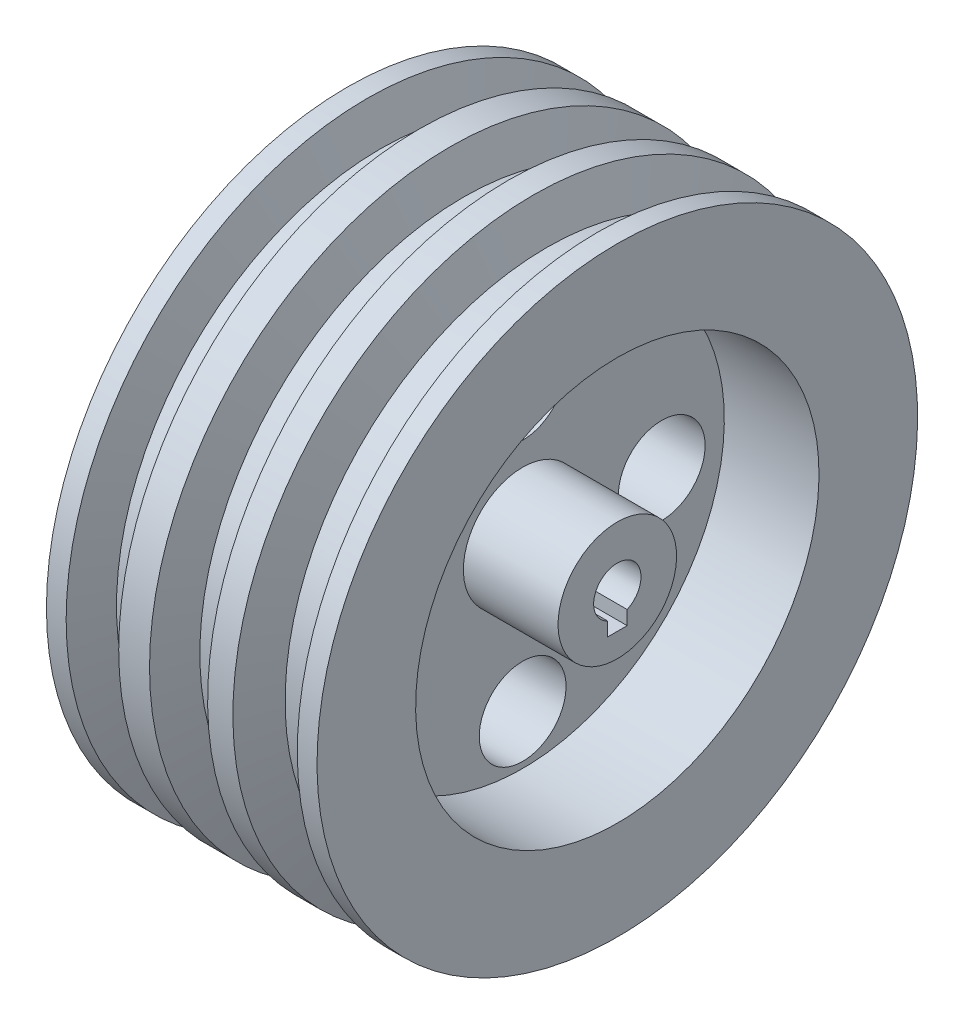
ISO-10303-21;
HEADER;
FILE_DESCRIPTION(('STEP AP214'),'2;1');
FILE_NAME('part.step','',(''),(''),'','','');
FILE_SCHEMA(('AUTOMOTIVE_DESIGN { 1 0 10303 214 1 1 1 1 }'));
ENDSEC;
DATA;
#1=APPLICATION_CONTEXT('core data for automotive mechanical design processes');
#2=APPLICATION_PROTOCOL_DEFINITION('international standard','automotive_design',2000,#1);
#3=PRODUCT_CONTEXT('',#1,'mechanical');
#4=PRODUCT('Part','Part','',(#3));
#5=PRODUCT_RELATED_PRODUCT_CATEGORY('part','',(#4));
#6=PRODUCT_DEFINITION_FORMATION('','',#4);
#7=PRODUCT_DEFINITION_CONTEXT('part definition',#1,'design');
#8=PRODUCT_DEFINITION('design','',#6,#7);
#9=PRODUCT_DEFINITION_SHAPE('','',#8);
#10=(LENGTH_UNIT() NAMED_UNIT(*) SI_UNIT(.MILLI.,.METRE.));
#11=(NAMED_UNIT(*) PLANE_ANGLE_UNIT() SI_UNIT($,.RADIAN.));
#12=(NAMED_UNIT(*) SI_UNIT($,.STERADIAN.) SOLID_ANGLE_UNIT());
#13=UNCERTAINTY_MEASURE_WITH_UNIT(LENGTH_MEASURE(1.E-05),#10,'distance_accuracy_value','');
#14=(GEOMETRIC_REPRESENTATION_CONTEXT(3) GLOBAL_UNCERTAINTY_ASSIGNED_CONTEXT((#13)) GLOBAL_UNIT_ASSIGNED_CONTEXT((#10,
#11,#12)) REPRESENTATION_CONTEXT('',''));
#15=CARTESIAN_POINT('',(0.,0.,0.));
#16=DIRECTION('',(0.,0.,1.));
#17=DIRECTION('',(1.,0.,0.));
#18=AXIS2_PLACEMENT_3D('',#15,#16,#17);
#19=CARTESIAN_POINT('',(35.,0.,0.));
#20=DIRECTION('',(-1.,0.,0.));
#21=DIRECTION('',(0.,-1.,0.));
#22=AXIS2_PLACEMENT_3D('',#19,#20,#21);
#23=PLANE('',#22);
#24=CARTESIAN_POINT('',(35.,3.3076923076923,0.));
#25=DIRECTION('',(1.,0.,0.));
#26=DIRECTION('',(0.,1.,0.));
#27=AXIS2_PLACEMENT_3D('',#24,#25,#26);
#28=CIRCLE('',#27,51.1282051282051);
#29=CARTESIAN_POINT('',(35.,54.4358974358974,0.));
#30=VERTEX_POINT('',#29);
#31=EDGE_CURVE('E125',#30,#30,#28,.T.);
#32=ORIENTED_EDGE('',*,*,#31,.F.);
#33=EDGE_LOOP('',(#32));
#34=FACE_BOUND('',#33,.T.);
#35=CARTESIAN_POINT('',(35.,3.3076923076923,0.));
#36=DIRECTION('',(1.,0.,0.));
#37=DIRECTION('',(0.,1.,0.));
#38=AXIS2_PLACEMENT_3D('',#35,#36,#37);
#39=CIRCLE('',#38,76.1282051282051);
#40=CARTESIAN_POINT('',(35.,79.4358974358974,0.));
#41=VERTEX_POINT('',#40);
#42=EDGE_CURVE('E42',#41,#41,#39,.T.);
#43=ORIENTED_EDGE('',*,*,#42,.T.);
#44=EDGE_LOOP('',(#43));
#45=FACE_BOUND('',#44,.T.);
#46=ADVANCED_FACE('F35',(#34,#45),#23,.F.);
#47=CARTESIAN_POINT('',(74.1794871794872,3.30769230769231,0.));
#48=DIRECTION('',(1.,0.,0.));
#49=DIRECTION('',(0.,1.,0.));
#50=AXIS2_PLACEMENT_3D('',#47,#48,#49);
#51=CYLINDRICAL_SURFACE('',#50,76.1282051282051);
#52=ORIENTED_EDGE('',*,*,#42,.F.);
#53=EDGE_LOOP('',(#52));
#54=FACE_BOUND('',#53,.T.);
#55=CARTESIAN_POINT('',(30.,3.3076923076923,0.));
#56=DIRECTION('',(1.,0.,0.));
#57=DIRECTION('',(0.,1.,0.));
#58=AXIS2_PLACEMENT_3D('',#55,#56,#57);
#59=CIRCLE('',#58,76.1282051282051);
#60=CARTESIAN_POINT('',(30.,79.4358974358974,0.));
#61=VERTEX_POINT('',#60);
#62=EDGE_CURVE('E190',#61,#61,#59,.T.);
#63=ORIENTED_EDGE('',*,*,#62,.T.);
#64=EDGE_LOOP('',(#63));
#65=FACE_BOUND('',#64,.T.);
#66=ADVANCED_FACE('F196',(#54,#65),#51,.T.);
#67=CARTESIAN_POINT('',(26.4750566288104,3.3076923076923,0.));
#68=DIRECTION('',(1.,0.,0.));
#69=DIRECTION('',(0.,1.,0.));
#70=AXIS2_PLACEMENT_3D('',#67,#68,#69);
#71=CONICAL_SURFACE('',#70,66.4435028110051,1.22173047639604);
#72=ORIENTED_EDGE('',*,*,#62,.F.);
#73=EDGE_LOOP('',(#72));
#74=FACE_BOUND('',#73,.T.);
#75=CARTESIAN_POINT('',(26.4750566288104,3.3076923076923,0.));
#76=DIRECTION('',(1.,0.,0.));
#77=DIRECTION('',(0.,1.,0.));
#78=AXIS2_PLACEMENT_3D('',#75,#76,#77);
#79=CIRCLE('',#78,66.4435028110051);
#80=CARTESIAN_POINT('',(26.4750566288103,69.7511951186974,0.));
#81=VERTEX_POINT('',#80);
#82=EDGE_CURVE('E187',#81,#81,#79,.T.);
#83=ORIENTED_EDGE('',*,*,#82,.T.);
#84=EDGE_LOOP('',(#83));
#85=FACE_BOUND('',#84,.T.);
#86=ADVANCED_FACE('F199',(#74,#85),#71,.T.);
#87=CARTESIAN_POINT('',(74.1794871794872,3.30769230769231,0.));
#88=DIRECTION('',(1.,0.,0.));
#89=DIRECTION('',(0.,1.,0.));
#90=AXIS2_PLACEMENT_3D('',#87,#88,#89);
#91=CYLINDRICAL_SURFACE('',#90,66.4435028110051);
#92=ORIENTED_EDGE('',*,*,#82,.F.);
#93=EDGE_LOOP('',(#92));
#94=FACE_BOUND('',#93,.T.);
#95=CARTESIAN_POINT('',(17.2265865441587,3.3076923076923,0.));
#96=DIRECTION('',(1.,0.,0.));
#97=DIRECTION('',(0.,1.,0.));
#98=AXIS2_PLACEMENT_3D('',#95,#96,#97);
#99=CIRCLE('',#98,66.4435028110051);
#100=CARTESIAN_POINT('',(17.2265865441587,69.7511951186974,0.));
#101=VERTEX_POINT('',#100);
#102=EDGE_CURVE('E184',#101,#101,#99,.T.);
#103=ORIENTED_EDGE('',*,*,#102,.T.);
#104=EDGE_LOOP('',(#103));
#105=FACE_BOUND('',#104,.T.);
#106=ADVANCED_FACE('F204',(#94,#105),#91,.T.);
#107=CARTESIAN_POINT('',(13.6942255874524,3.3076923076923,0.));
#108=DIRECTION('',(-1.,0.,0.));
#109=DIRECTION('',(0.,-1.,0.));
#110=AXIS2_PLACEMENT_3D('',#107,#108,#109);
#111=CONICAL_SURFACE('',#110,76.1485847769188,1.22173047639604);
#112=ORIENTED_EDGE('',*,*,#102,.F.);
#113=EDGE_LOOP('',(#112));
#114=FACE_BOUND('',#113,.T.);
#115=CARTESIAN_POINT('',(13.6942255874524,3.3076923076923,0.));
#116=DIRECTION('',(1.,0.,0.));
#117=DIRECTION('',(0.,1.,0.));
#118=AXIS2_PLACEMENT_3D('',#115,#116,#117);
#119=CIRCLE('',#118,76.1485847769189);
#120=CARTESIAN_POINT('',(13.6942255874524,79.4562770846112,0.));
#121=VERTEX_POINT('',#120);
#122=EDGE_CURVE('E181',#121,#121,#119,.T.);
#123=ORIENTED_EDGE('',*,*,#122,.T.);
#124=EDGE_LOOP('',(#123));
#125=FACE_BOUND('',#124,.T.);
#126=ADVANCED_FACE('F210',(#114,#125),#111,.T.);
#127=CARTESIAN_POINT('',(74.1794871794872,3.30769230769231,0.));
#128=DIRECTION('',(1.,0.,0.));
#129=DIRECTION('',(0.,1.,0.));
#130=AXIS2_PLACEMENT_3D('',#127,#128,#129);
#131=CYLINDRICAL_SURFACE('',#130,76.1485847769189);
#132=ORIENTED_EDGE('',*,*,#122,.F.);
#133=EDGE_LOOP('',(#132));
#134=FACE_BOUND('',#133,.T.);
#135=CARTESIAN_POINT('',(7.28740547758823,3.3076923076923,0.));
#136=DIRECTION('',(1.,0.,0.));
#137=DIRECTION('',(0.,1.,0.));
#138=AXIS2_PLACEMENT_3D('',#135,#136,#137);
#139=CIRCLE('',#138,76.1485847769189);
#140=CARTESIAN_POINT('',(7.28740547758822,79.4562770846112,0.));
#141=VERTEX_POINT('',#140);
#142=EDGE_CURVE('E178',#141,#141,#139,.T.);
#143=ORIENTED_EDGE('',*,*,#142,.T.);
#144=EDGE_LOOP('',(#143));
#145=FACE_BOUND('',#144,.T.);
#146=ADVANCED_FACE('F216',(#134,#145),#131,.T.);
#147=CARTESIAN_POINT('',(3.91051685733067,3.3076923076923,0.));
#148=DIRECTION('',(1.,0.,0.));
#149=DIRECTION('',(0.,1.,0.));
#150=AXIS2_PLACEMENT_3D('',#147,#148,#149);
#151=CONICAL_SURFACE('',#150,66.8706595447477,1.22173047639604);
#152=ORIENTED_EDGE('',*,*,#142,.F.);
#153=EDGE_LOOP('',(#152));
#154=FACE_BOUND('',#153,.T.);
#155=CARTESIAN_POINT('',(3.91051685733067,3.3076923076923,0.));
#156=DIRECTION('',(1.,0.,0.));
#157=DIRECTION('',(0.,1.,0.));
#158=AXIS2_PLACEMENT_3D('',#155,#156,#157);
#159=CIRCLE('',#158,66.8706595447478);
#160=CARTESIAN_POINT('',(3.91051685733066,70.17835185244,0.));
#161=VERTEX_POINT('',#160);
#162=EDGE_CURVE('E175',#161,#161,#159,.T.);
#163=ORIENTED_EDGE('',*,*,#162,.T.);
#164=EDGE_LOOP('',(#163));
#165=FACE_BOUND('',#164,.T.);
#166=ADVANCED_FACE('F222',(#154,#165),#151,.T.);
#167=CARTESIAN_POINT('',(74.1794871794872,3.30769230769231,0.));
#168=DIRECTION('',(1.,0.,0.));
#169=DIRECTION('',(0.,1.,0.));
#170=AXIS2_PLACEMENT_3D('',#167,#168,#169);
#171=CYLINDRICAL_SURFACE('',#170,66.8706595447477);
#172=ORIENTED_EDGE('',*,*,#162,.F.);
#173=EDGE_LOOP('',(#172));
#174=FACE_BOUND('',#173,.T.);
#175=CARTESIAN_POINT('',(-3.9608304898895,3.3076923076923,0.));
#176=DIRECTION('',(1.,0.,0.));
#177=DIRECTION('',(0.,1.,0.));
#178=AXIS2_PLACEMENT_3D('',#175,#176,#177);
#179=CIRCLE('',#178,66.8706595447478);
#180=CARTESIAN_POINT('',(-3.96083048988951,70.17835185244,0.));
#181=VERTEX_POINT('',#180);
#182=EDGE_CURVE('E172',#181,#181,#179,.T.);
#183=ORIENTED_EDGE('',*,*,#182,.T.);
#184=EDGE_LOOP('',(#183));
#185=FACE_BOUND('',#184,.T.);
#186=ADVANCED_FACE('F228',(#174,#185),#171,.T.);
#187=CARTESIAN_POINT('',(-7.36488321578584,3.3076923076923,0.));
#188=DIRECTION('',(-1.,0.,0.));
#189=DIRECTION('',(0.,-1.,0.));
#190=AXIS2_PLACEMENT_3D('',#187,#188,#189);
#191=CONICAL_SURFACE('',#190,76.223217543781,1.22173047639604);
#192=ORIENTED_EDGE('',*,*,#182,.F.);
#193=EDGE_LOOP('',(#192));
#194=FACE_BOUND('',#193,.T.);
#195=CARTESIAN_POINT('',(-7.36488321578584,3.3076923076923,0.));
#196=DIRECTION('',(1.,0.,0.));
#197=DIRECTION('',(0.,1.,0.));
#198=AXIS2_PLACEMENT_3D('',#195,#196,#197);
#199=CIRCLE('',#198,76.2232175437811);
#200=CARTESIAN_POINT('',(-7.36488321578585,79.5309098514734,0.));
#201=VERTEX_POINT('',#200);
#202=EDGE_CURVE('E169',#201,#201,#199,.T.);
#203=ORIENTED_EDGE('',*,*,#202,.T.);
#204=EDGE_LOOP('',(#203));
#205=FACE_BOUND('',#204,.T.);
#206=ADVANCED_FACE('F234',(#194,#205),#191,.T.);
#207=CARTESIAN_POINT('',(74.1794871794872,3.30769230769231,0.));
#208=DIRECTION('',(1.,0.,0.));
#209=DIRECTION('',(0.,1.,0.));
#210=AXIS2_PLACEMENT_3D('',#207,#208,#209);
#211=CYLINDRICAL_SURFACE('',#210,76.223217543781);
#212=ORIENTED_EDGE('',*,*,#202,.F.);
#213=EDGE_LOOP('',(#212));
#214=FACE_BOUND('',#213,.T.);
#215=CARTESIAN_POINT('',(-15.1773010662251,3.3076923076923,0.));
#216=DIRECTION('',(1.,0.,0.));
#217=DIRECTION('',(0.,1.,0.));
#218=AXIS2_PLACEMENT_3D('',#215,#216,#217);
#219=CIRCLE('',#218,76.223217543781);
#220=CARTESIAN_POINT('',(-15.1773010662251,79.5309098514734,0.));
#221=VERTEX_POINT('',#220);
#222=EDGE_CURVE('E166',#221,#221,#219,.T.);
#223=ORIENTED_EDGE('',*,*,#222,.T.);
#224=EDGE_LOOP('',(#223));
#225=FACE_BOUND('',#224,.T.);
#226=ADVANCED_FACE('F240',(#214,#225),#211,.T.);
#227=CARTESIAN_POINT('',(-18.5541896864826,3.3076923076923,0.));
#228=DIRECTION('',(1.,0.,0.));
#229=DIRECTION('',(0.,1.,0.));
#230=AXIS2_PLACEMENT_3D('',#227,#228,#229);
#231=CONICAL_SURFACE('',#230,66.9452923116099,1.22173047639604);
#232=ORIENTED_EDGE('',*,*,#222,.F.);
#233=EDGE_LOOP('',(#232));
#234=FACE_BOUND('',#233,.T.);
#235=CARTESIAN_POINT('',(-18.5541896864826,3.3076923076923,0.));
#236=DIRECTION('',(1.,0.,0.));
#237=DIRECTION('',(0.,1.,0.));
#238=AXIS2_PLACEMENT_3D('',#235,#236,#237);
#239=CIRCLE('',#238,66.9452923116099);
#240=CARTESIAN_POINT('',(-18.5541896864826,70.2529846193023,0.));
#241=VERTEX_POINT('',#240);
#242=EDGE_CURVE('E163',#241,#241,#239,.T.);
#243=ORIENTED_EDGE('',*,*,#242,.T.);
#244=EDGE_LOOP('',(#243));
#245=FACE_BOUND('',#244,.T.);
#246=ADVANCED_FACE('F246',(#234,#245),#231,.T.);
#247=CARTESIAN_POINT('',(74.1794871794872,3.30769230769231,0.));
#248=DIRECTION('',(1.,0.,0.));
#249=DIRECTION('',(0.,1.,0.));
#250=AXIS2_PLACEMENT_3D('',#247,#248,#249);
#251=CYLINDRICAL_SURFACE('',#250,66.9452923116099);
#252=ORIENTED_EDGE('',*,*,#242,.F.);
#253=EDGE_LOOP('',(#252));
#254=FACE_BOUND('',#253,.T.);
#255=CARTESIAN_POINT('',(-25.0199392931278,3.3076923076923,0.));
#256=DIRECTION('',(1.,0.,0.));
#257=DIRECTION('',(0.,1.,0.));
#258=AXIS2_PLACEMENT_3D('',#255,#256,#257);
#259=CIRCLE('',#258,66.9452923116099);
#260=CARTESIAN_POINT('',(-25.0199392931278,70.2529846193022,0.));
#261=VERTEX_POINT('',#260);
#262=EDGE_CURVE('E160',#261,#261,#259,.T.);
#263=ORIENTED_EDGE('',*,*,#262,.T.);
#264=EDGE_LOOP('',(#263));
#265=FACE_BOUND('',#264,.T.);
#266=ADVANCED_FACE('F252',(#254,#265),#251,.T.);
#267=CARTESIAN_POINT('',(-28.4239920190241,3.3076923076923,0.));
#268=DIRECTION('',(-1.,0.,0.));
#269=DIRECTION('',(0.,-1.,0.));
#270=AXIS2_PLACEMENT_3D('',#267,#268,#269);
#271=CONICAL_SURFACE('',#270,76.2978503106433,1.22173047639604);
#272=ORIENTED_EDGE('',*,*,#262,.F.);
#273=EDGE_LOOP('',(#272));
#274=FACE_BOUND('',#273,.T.);
#275=CARTESIAN_POINT('',(-28.4239920190241,3.3076923076923,0.));
#276=DIRECTION('',(1.,0.,0.));
#277=DIRECTION('',(0.,1.,0.));
#278=AXIS2_PLACEMENT_3D('',#275,#276,#277);
#279=CIRCLE('',#278,76.2978503106433);
#280=CARTESIAN_POINT('',(-28.4239920190241,79.6055426183356,0.));
#281=VERTEX_POINT('',#280);
#282=EDGE_CURVE('E157',#281,#281,#279,.T.);
#283=ORIENTED_EDGE('',*,*,#282,.T.);
#284=EDGE_LOOP('',(#283));
#285=FACE_BOUND('',#284,.T.);
#286=ADVANCED_FACE('F258',(#274,#285),#271,.T.);
#287=CARTESIAN_POINT('',(74.1794871794872,3.30769230769231,0.));
#288=DIRECTION('',(1.,0.,0.));
#289=DIRECTION('',(0.,1.,0.));
#290=AXIS2_PLACEMENT_3D('',#287,#288,#289);
#291=CYLINDRICAL_SURFACE('',#290,76.2978503106433);
#292=ORIENTED_EDGE('',*,*,#282,.F.);
#293=EDGE_LOOP('',(#292));
#294=FACE_BOUND('',#293,.T.);
#295=CARTESIAN_POINT('',(-33.4239920190241,3.3076923076923,0.));
#296=DIRECTION('',(1.,0.,0.));
#297=DIRECTION('',(0.,1.,0.));
#298=AXIS2_PLACEMENT_3D('',#295,#296,#297);
#299=CIRCLE('',#298,76.2978503106433);
#300=CARTESIAN_POINT('',(-33.4239920190241,79.6055426183355,0.));
#301=VERTEX_POINT('',#300);
#302=EDGE_CURVE('E154',#301,#301,#299,.T.);
#303=ORIENTED_EDGE('',*,*,#302,.T.);
#304=EDGE_LOOP('',(#303));
#305=FACE_BOUND('',#304,.T.);
#306=ADVANCED_FACE('F264',(#294,#305),#291,.T.);
#307=CARTESIAN_POINT('',(-33.4239920190241,0.,0.));
#308=DIRECTION('',(1.,0.,0.));
#309=DIRECTION('',(0.,1.,0.));
#310=AXIS2_PLACEMENT_3D('',#307,#308,#309);
#311=PLANE('',#310);
#312=ORIENTED_EDGE('',*,*,#302,.F.);
#313=EDGE_LOOP('',(#312));
#314=FACE_BOUND('',#313,.T.);
#315=CARTESIAN_POINT('',(-33.4239920190241,3.3076923076923,0.));
#316=DIRECTION('',(1.,0.,0.));
#317=DIRECTION('',(0.,1.,0.));
#318=AXIS2_PLACEMENT_3D('',#315,#316,#317);
#319=CIRCLE('',#318,51.2978503106433);
#320=CARTESIAN_POINT('',(-33.4239920190241,54.6055426183355,0.));
#321=VERTEX_POINT('',#320);
#322=EDGE_CURVE('E151',#321,#321,#319,.T.);
#323=ORIENTED_EDGE('',*,*,#322,.T.);
#324=EDGE_LOOP('',(#323));
#325=FACE_BOUND('',#324,.T.);
#326=ADVANCED_FACE('F270',(#314,#325),#311,.F.);
#327=CARTESIAN_POINT('',(74.1794871794872,3.30769230769231,0.));
#328=DIRECTION('',(1.,0.,0.));
#329=DIRECTION('',(0.,1.,0.));
#330=AXIS2_PLACEMENT_3D('',#327,#328,#329);
#331=CYLINDRICAL_SURFACE('',#330,51.2978503106433);
#332=ORIENTED_EDGE('',*,*,#322,.F.);
#333=EDGE_LOOP('',(#332));
#334=FACE_BOUND('',#333,.T.);
#335=CARTESIAN_POINT('',(-11.,3.3076923076923,0.));
#336=DIRECTION('',(1.,0.,0.));
#337=DIRECTION('',(0.,1.,0.));
#338=AXIS2_PLACEMENT_3D('',#335,#336,#337);
#339=CIRCLE('',#338,51.2978503106432);
#340=CARTESIAN_POINT('',(-11.,54.6055426183355,0.));
#341=VERTEX_POINT('',#340);
#342=EDGE_CURVE('E148',#341,#341,#339,.T.);
#343=ORIENTED_EDGE('',*,*,#342,.T.);
#344=EDGE_LOOP('',(#343));
#345=FACE_BOUND('',#344,.T.);
#346=ADVANCED_FACE('F276',(#334,#345),#331,.F.);
#347=CARTESIAN_POINT('',(-11.,0.,0.));
#348=DIRECTION('',(1.,0.,0.));
#349=DIRECTION('',(0.,1.,0.));
#350=AXIS2_PLACEMENT_3D('',#347,#348,#349);
#351=PLANE('',#350);
#352=CARTESIAN_POINT('',(-11.,-1.00124435404936E-12,35.2569151452964));
#353=DIRECTION('',(1.,0.,0.));
#354=DIRECTION('',(0.,1.,0.));
#355=AXIS2_PLACEMENT_3D('',#352,#353,#354);
#356=CIRCLE('',#355,11.0000000000016);
#357=CARTESIAN_POINT('',(-11.,11.0000000000006,35.2569151452964));
#358=VERTEX_POINT('',#357);
#359=EDGE_CURVE('E122',#358,#358,#356,.T.);
#360=ORIENTED_EDGE('',*,*,#359,.T.);
#361=EDGE_LOOP('',(#360));
#362=FACE_BOUND('',#361,.T.);
#363=CARTESIAN_POINT('',(-11.,9.9424378763864E-13,-35.2569151452984));
#364=DIRECTION('',(1.,0.,0.));
#365=DIRECTION('',(0.,1.,0.));
#366=AXIS2_PLACEMENT_3D('',#363,#364,#365);
#367=CIRCLE('',#366,11.0000000000008);
#368=CARTESIAN_POINT('',(-11.,11.0000000000018,-35.2569151452984));
#369=VERTEX_POINT('',#368);
#370=EDGE_CURVE('E119',#369,#369,#367,.T.);
#371=ORIENTED_EDGE('',*,*,#370,.T.);
#372=EDGE_LOOP('',(#371));
#373=FACE_BOUND('',#372,.T.);
#374=CARTESIAN_POINT('',(-11.,-35.2569151452974,-1.99117041485995E-12));
#375=DIRECTION('',(1.,0.,0.));
#376=DIRECTION('',(0.,1.,0.));
#377=AXIS2_PLACEMENT_3D('',#374,#375,#376);
#378=CIRCLE('',#377,11.0000000000021);
#379=CARTESIAN_POINT('',(-11.,-24.2569151452952,-1.99117041485995E-12));
#380=VERTEX_POINT('',#379);
#381=EDGE_CURVE('E116',#380,#380,#378,.T.);
#382=ORIENTED_EDGE('',*,*,#381,.T.);
#383=EDGE_LOOP('',(#382));
#384=FACE_BOUND('',#383,.T.);
#385=CARTESIAN_POINT('',(-11.,35.2569151452974,0.));
#386=DIRECTION('',(1.,0.,0.));
#387=DIRECTION('',(0.,1.,0.));
#388=AXIS2_PLACEMENT_3D('',#385,#386,#387);
#389=CIRCLE('',#388,11.);
#390=CARTESIAN_POINT('',(-11.,46.2569151452974,0.));
#391=VERTEX_POINT('',#390);
#392=EDGE_CURVE('E105',#391,#391,#389,.T.);
#393=ORIENTED_EDGE('',*,*,#392,.T.);
#394=EDGE_LOOP('',(#393));
#395=FACE_BOUND('',#394,.T.);
#396=ORIENTED_EDGE('',*,*,#342,.F.);
#397=EDGE_LOOP('',(#396));
#398=FACE_BOUND('',#397,.T.);
#399=CARTESIAN_POINT('',(-11.,3.3076923076923,0.));
#400=DIRECTION('',(1.,0.,0.));
#401=DIRECTION('',(0.,1.,0.));
#402=AXIS2_PLACEMENT_3D('',#399,#400,#401);
#403=CIRCLE('',#402,15.025641025641);
#404=CARTESIAN_POINT('',(-11.,18.3333333333333,0.));
#405=VERTEX_POINT('',#404);
#406=EDGE_CURVE('E145',#405,#405,#403,.T.);
#407=ORIENTED_EDGE('',*,*,#406,.T.);
#408=EDGE_LOOP('',(#407));
#409=FACE_BOUND('',#408,.T.);
#410=ADVANCED_FACE('F282',(#362,#373,#384,#395,#398,#409),#351,.F.);
#411=CARTESIAN_POINT('',(74.1794871794872,3.30769230769231,0.));
#412=DIRECTION('',(1.,0.,0.));
#413=DIRECTION('',(0.,1.,0.));
#414=AXIS2_PLACEMENT_3D('',#411,#412,#413);
#415=CYLINDRICAL_SURFACE('',#414,15.025641025641);
#416=CARTESIAN_POINT('',(-35.,3.3076923076923,0.));
#417=DIRECTION('',(1.,0.,0.));
#418=DIRECTION('',(0.,1.,0.));
#419=AXIS2_PLACEMENT_3D('',#416,#417,#418);
#420=CIRCLE('',#419,15.025641025641);
#421=CARTESIAN_POINT('',(-35.,18.3333333333333,0.));
#422=VERTEX_POINT('',#421);
#423=EDGE_CURVE('E142',#422,#422,#420,.T.);
#424=ORIENTED_EDGE('',*,*,#423,.T.);
#425=EDGE_LOOP('',(#424));
#426=FACE_BOUND('',#425,.T.);
#427=ORIENTED_EDGE('',*,*,#406,.F.);
#428=EDGE_LOOP('',(#427));
#429=FACE_BOUND('',#428,.T.);
#430=ADVANCED_FACE('F288',(#426,#429),#415,.T.);
#431=CARTESIAN_POINT('',(-35.,0.,0.));
#432=DIRECTION('',(1.,0.,0.));
#433=DIRECTION('',(0.,1.,0.));
#434=AXIS2_PLACEMENT_3D('',#431,#432,#433);
#435=PLANE('',#434);
#436=ORIENTED_EDGE('',*,*,#423,.F.);
#437=EDGE_LOOP('',(#436));
#438=FACE_BOUND('',#437,.T.);
#439=CARTESIAN_POINT('',(-35.,3.3076923076923,0.));
#440=DIRECTION('',(1.,0.,0.));
#441=DIRECTION('',(0.,1.,0.));
#442=AXIS2_PLACEMENT_3D('',#439,#440,#441);
#443=CIRCLE('',#442,6.00000000000001);
#444=CARTESIAN_POINT('',(-35.,-2.14666374962557,-2.5));
#445=VERTEX_POINT('',#444);
#446=CARTESIAN_POINT('',(-35.,-2.14666374962557,2.5));
#447=VERTEX_POINT('',#446);
#448=EDGE_CURVE('E139',#445,#447,#443,.T.);
#449=ORIENTED_EDGE('',*,*,#448,.T.);
#450=DIRECTION('',(0.,1.,0.));
#451=VECTOR('',#450,1.);
#452=CARTESIAN_POINT('',(-35.,0.307692307692287,2.5));
#453=LINE('',#452,#451);
#454=CARTESIAN_POINT('',(-35.,-5.69230769230771,2.5));
#455=VERTEX_POINT('',#454);
#456=EDGE_CURVE('E94',#455,#447,#453,.T.);
#457=ORIENTED_EDGE('',*,*,#456,.F.);
#458=DIRECTION('',(0.,0.,1.));
#459=VECTOR('',#458,1.);
#460=CARTESIAN_POINT('',(-35.,-5.69230769230771,-2.5));
#461=LINE('',#460,#459);
#462=CARTESIAN_POINT('',(-35.,-5.69230769230771,-2.5));
#463=VERTEX_POINT('',#462);
#464=EDGE_CURVE('E77',#463,#455,#461,.T.);
#465=ORIENTED_EDGE('',*,*,#464,.F.);
#466=DIRECTION('',(0.,-1.,0.));
#467=VECTOR('',#466,1.);
#468=CARTESIAN_POINT('',(-35.,0.307692307692287,-2.5));
#469=LINE('',#468,#467);
#470=EDGE_CURVE('E96',#445,#463,#469,.T.);
#471=ORIENTED_EDGE('',*,*,#470,.F.);
#472=EDGE_LOOP('',(#449,#457,#465,#471));
#473=FACE_BOUND('',#472,.T.);
#474=ADVANCED_FACE('F294',(#438,#473),#435,.F.);
#475=CARTESIAN_POINT('',(74.1794871794872,3.30769230769231,0.));
#476=DIRECTION('',(1.,0.,0.));
#477=DIRECTION('',(0.,1.,0.));
#478=AXIS2_PLACEMENT_3D('',#475,#476,#477);
#479=CYLINDRICAL_SURFACE('',#478,6.00000000000001);
#480=DIRECTION('',(1.,0.,0.));
#481=VECTOR('',#480,1.);
#482=CARTESIAN_POINT('',(74.1794871794872,-2.14666374962556,2.5));
#483=LINE('',#482,#481);
#484=CARTESIAN_POINT('',(35.,-2.14666374962556,2.5));
#485=VERTEX_POINT('',#484);
#486=EDGE_CURVE('E57',#447,#485,#483,.T.);
#487=ORIENTED_EDGE('',*,*,#486,.F.);
#488=ORIENTED_EDGE('',*,*,#448,.F.);
#489=DIRECTION('',(1.,0.,0.));
#490=VECTOR('',#489,1.);
#491=CARTESIAN_POINT('',(74.1794871794872,-2.14666374962556,-2.5));
#492=LINE('',#491,#490);
#493=CARTESIAN_POINT('',(35.,-2.14666374962556,-2.5));
#494=VERTEX_POINT('',#493);
#495=EDGE_CURVE('E79',#494,#445,#492,.F.);
#496=ORIENTED_EDGE('',*,*,#495,.F.);
#497=CARTESIAN_POINT('',(35.,3.3076923076923,0.));
#498=DIRECTION('',(1.,0.,0.));
#499=DIRECTION('',(0.,1.,0.));
#500=AXIS2_PLACEMENT_3D('',#497,#498,#499);
#501=CIRCLE('',#500,6.00000000000001);
#502=EDGE_CURVE('E137',#494,#485,#501,.T.);
#503=ORIENTED_EDGE('',*,*,#502,.T.);
#504=EDGE_LOOP('',(#487,#488,#496,#503));
#505=FACE_BOUND('',#504,.T.);
#506=ADVANCED_FACE('F300',(#505),#479,.F.);
#507=CARTESIAN_POINT('',(35.,0.,0.));
#508=DIRECTION('',(1.,0.,0.));
#509=DIRECTION('',(0.,1.,0.));
#510=AXIS2_PLACEMENT_3D('',#507,#508,#509);
#511=PLANE('',#510);
#512=DIRECTION('',(0.,1.,0.));
#513=VECTOR('',#512,1.);
#514=CARTESIAN_POINT('',(35.,0.307692307692296,2.5));
#515=LINE('',#514,#513);
#516=CARTESIAN_POINT('',(35.,-5.6923076923077,2.5));
#517=VERTEX_POINT('',#516);
#518=EDGE_CURVE('E82',#517,#485,#515,.T.);
#519=ORIENTED_EDGE('',*,*,#518,.T.);
#520=ORIENTED_EDGE('',*,*,#502,.F.);
#521=DIRECTION('',(0.,1.,0.));
#522=VECTOR('',#521,1.);
#523=CARTESIAN_POINT('',(35.,0.,-2.5));
#524=LINE('',#523,#522);
#525=CARTESIAN_POINT('',(35.,-5.69230769230771,-2.5));
#526=VERTEX_POINT('',#525);
#527=EDGE_CURVE('E11',#526,#494,#524,.T.);
#528=ORIENTED_EDGE('',*,*,#527,.F.);
#529=DIRECTION('',(0.,0.,1.));
#530=VECTOR('',#529,1.);
#531=CARTESIAN_POINT('',(35.,-5.6923076923077,-2.5));
#532=LINE('',#531,#530);
#533=EDGE_CURVE('E49',#526,#517,#532,.T.);
#534=ORIENTED_EDGE('',*,*,#533,.T.);
#535=EDGE_LOOP('',(#519,#520,#528,#534));
#536=FACE_BOUND('',#535,.T.);
#537=CARTESIAN_POINT('',(35.,3.3076923076923,0.));
#538=DIRECTION('',(1.,0.,0.));
#539=DIRECTION('',(0.,1.,0.));
#540=AXIS2_PLACEMENT_3D('',#537,#538,#539);
#541=CIRCLE('',#540,15.025641025641);
#542=CARTESIAN_POINT('',(35.,18.3333333333333,0.));
#543=VERTEX_POINT('',#542);
#544=EDGE_CURVE('E134',#543,#543,#541,.T.);
#545=ORIENTED_EDGE('',*,*,#544,.T.);
#546=EDGE_LOOP('',(#545));
#547=FACE_BOUND('',#546,.T.);
#548=ADVANCED_FACE('F89',(#536,#547),#511,.T.);
#549=CARTESIAN_POINT('',(74.1794871794872,3.30769230769231,0.));
#550=DIRECTION('',(1.,0.,0.));
#551=DIRECTION('',(0.,1.,0.));
#552=AXIS2_PLACEMENT_3D('',#549,#550,#551);
#553=CYLINDRICAL_SURFACE('',#552,15.025641025641);
#554=CARTESIAN_POINT('',(11.,3.3076923076923,0.));
#555=DIRECTION('',(1.,0.,0.));
#556=DIRECTION('',(0.,1.,0.));
#557=AXIS2_PLACEMENT_3D('',#554,#555,#556);
#558=CIRCLE('',#557,15.025641025641);
#559=CARTESIAN_POINT('',(11.,18.3333333333333,0.));
#560=VERTEX_POINT('',#559);
#561=EDGE_CURVE('E131',#560,#560,#558,.T.);
#562=ORIENTED_EDGE('',*,*,#561,.T.);
#563=EDGE_LOOP('',(#562));
#564=FACE_BOUND('',#563,.T.);
#565=ORIENTED_EDGE('',*,*,#544,.F.);
#566=EDGE_LOOP('',(#565));
#567=FACE_BOUND('',#566,.T.);
#568=ADVANCED_FACE('F319',(#564,#567),#553,.T.);
#569=CARTESIAN_POINT('',(11.,0.,0.));
#570=DIRECTION('',(1.,0.,0.));
#571=DIRECTION('',(0.,1.,0.));
#572=AXIS2_PLACEMENT_3D('',#569,#570,#571);
#573=PLANE('',#572);
#574=CARTESIAN_POINT('',(11.,-9.9856151446669E-13,35.2569151452964));
#575=DIRECTION('',(1.,0.,0.));
#576=DIRECTION('',(0.,1.,0.));
#577=AXIS2_PLACEMENT_3D('',#574,#575,#576);
#578=CIRCLE('',#577,11.0000000000016);
#579=CARTESIAN_POINT('',(11.,11.0000000000006,35.2569151452964));
#580=VERTEX_POINT('',#579);
#581=EDGE_CURVE('E102',#580,#580,#578,.T.);
#582=ORIENTED_EDGE('',*,*,#581,.F.);
#583=EDGE_LOOP('',(#582));
#584=FACE_BOUND('',#583,.T.);
#585=CARTESIAN_POINT('',(11.,9.96926627221314E-13,-35.2569151452984));
#586=DIRECTION('',(1.,0.,0.));
#587=DIRECTION('',(0.,1.,0.));
#588=AXIS2_PLACEMENT_3D('',#585,#586,#587);
#589=CIRCLE('',#588,11.0000000000008);
#590=CARTESIAN_POINT('',(11.,11.0000000000018,-35.2569151452984));
#591=VERTEX_POINT('',#590);
#592=EDGE_CURVE('E106',#591,#591,#589,.T.);
#593=ORIENTED_EDGE('',*,*,#592,.F.);
#594=EDGE_LOOP('',(#593));
#595=FACE_BOUND('',#594,.T.);
#596=CARTESIAN_POINT('',(11.,-35.2569151452974,-1.99117041485995E-12));
#597=DIRECTION('',(1.,0.,0.));
#598=DIRECTION('',(0.,1.,0.));
#599=AXIS2_PLACEMENT_3D('',#596,#597,#598);
#600=CIRCLE('',#599,11.0000000000021);
#601=CARTESIAN_POINT('',(11.,-24.2569151452952,-1.99117041485995E-12));
#602=VERTEX_POINT('',#601);
#603=EDGE_CURVE('E109',#602,#602,#600,.T.);
#604=ORIENTED_EDGE('',*,*,#603,.F.);
#605=EDGE_LOOP('',(#604));
#606=FACE_BOUND('',#605,.T.);
#607=CARTESIAN_POINT('',(11.,35.2569151452974,0.));
#608=DIRECTION('',(1.,0.,0.));
#609=DIRECTION('',(0.,1.,0.));
#610=AXIS2_PLACEMENT_3D('',#607,#608,#609);
#611=CIRCLE('',#610,11.);
#612=CARTESIAN_POINT('',(11.,46.2569151452974,0.));
#613=VERTEX_POINT('',#612);
#614=EDGE_CURVE('E101',#613,#613,#611,.T.);
#615=ORIENTED_EDGE('',*,*,#614,.F.);
#616=EDGE_LOOP('',(#615));
#617=FACE_BOUND('',#616,.T.);
#618=CARTESIAN_POINT('',(11.,3.3076923076923,0.));
#619=DIRECTION('',(1.,0.,0.));
#620=DIRECTION('',(0.,1.,0.));
#621=AXIS2_PLACEMENT_3D('',#618,#619,#620);
#622=CIRCLE('',#621,51.1282051282051);
#623=CARTESIAN_POINT('',(11.,54.4358974358974,0.));
#624=VERTEX_POINT('',#623);
#625=EDGE_CURVE('E128',#624,#624,#622,.T.);
#626=ORIENTED_EDGE('',*,*,#625,.T.);
#627=EDGE_LOOP('',(#626));
#628=FACE_BOUND('',#627,.T.);
#629=ORIENTED_EDGE('',*,*,#561,.F.);
#630=EDGE_LOOP('',(#629));
#631=FACE_BOUND('',#630,.T.);
#632=ADVANCED_FACE('F313',(#584,#595,#606,#617,#628,#631),#573,.T.);
#633=CARTESIAN_POINT('',(74.1794871794872,3.30769230769231,0.));
#634=DIRECTION('',(1.,0.,0.));
#635=DIRECTION('',(0.,1.,0.));
#636=AXIS2_PLACEMENT_3D('',#633,#634,#635);
#637=CYLINDRICAL_SURFACE('',#636,51.1282051282051);
#638=ORIENTED_EDGE('',*,*,#31,.T.);
#639=EDGE_LOOP('',(#638));
#640=FACE_BOUND('',#639,.T.);
#641=ORIENTED_EDGE('',*,*,#625,.F.);
#642=EDGE_LOOP('',(#641));
#643=FACE_BOUND('',#642,.T.);
#644=ADVANCED_FACE('F309',(#640,#643),#637,.F.);
#645=CARTESIAN_POINT('',(-35.,35.2569151452974,0.));
#646=DIRECTION('',(1.,0.,0.));
#647=DIRECTION('',(0.,1.,0.));
#648=AXIS2_PLACEMENT_3D('',#645,#646,#647);
#649=CYLINDRICAL_SURFACE('',#648,11.);
#650=ORIENTED_EDGE('',*,*,#614,.T.);
#651=EDGE_LOOP('',(#650));
#652=FACE_BOUND('',#651,.T.);
#653=ORIENTED_EDGE('',*,*,#392,.F.);
#654=EDGE_LOOP('',(#653));
#655=FACE_BOUND('',#654,.T.);
#656=ADVANCED_FACE('F312',(#652,#655),#649,.F.);
#657=CARTESIAN_POINT('',(-35.,-35.2569151452974,-1.99117041485995E-12));
#658=DIRECTION('',(1.,0.,0.));
#659=DIRECTION('',(0.,1.,0.));
#660=AXIS2_PLACEMENT_3D('',#657,#658,#659);
#661=CYLINDRICAL_SURFACE('',#660,11.0000000000021);
#662=ORIENTED_EDGE('',*,*,#603,.T.);
#663=EDGE_LOOP('',(#662));
#664=FACE_BOUND('',#663,.T.);
#665=ORIENTED_EDGE('',*,*,#381,.F.);
#666=EDGE_LOOP('',(#665));
#667=FACE_BOUND('',#666,.T.);
#668=ADVANCED_FACE('F338',(#664,#667),#661,.F.);
#669=CARTESIAN_POINT('',(-35.,9.9131705354845E-13,-35.2569151452984));
#670=DIRECTION('',(1.,0.,0.));
#671=DIRECTION('',(0.,1.,0.));
#672=AXIS2_PLACEMENT_3D('',#669,#670,#671);
#673=CYLINDRICAL_SURFACE('',#672,11.0000000000008);
#674=ORIENTED_EDGE('',*,*,#592,.T.);
#675=EDGE_LOOP('',(#674));
#676=FACE_BOUND('',#675,.T.);
#677=ORIENTED_EDGE('',*,*,#370,.F.);
#678=EDGE_LOOP('',(#677));
#679=FACE_BOUND('',#678,.T.);
#680=ADVANCED_FACE('F342',(#676,#679),#673,.F.);
#681=CARTESIAN_POINT('',(-35.,-1.00417108813955E-12,35.2569151452964));
#682=DIRECTION('',(1.,0.,0.));
#683=DIRECTION('',(0.,1.,0.));
#684=AXIS2_PLACEMENT_3D('',#681,#682,#683);
#685=CYLINDRICAL_SURFACE('',#684,11.0000000000016);
#686=ORIENTED_EDGE('',*,*,#581,.T.);
#687=EDGE_LOOP('',(#686));
#688=FACE_BOUND('',#687,.T.);
#689=ORIENTED_EDGE('',*,*,#359,.F.);
#690=EDGE_LOOP('',(#689));
#691=FACE_BOUND('',#690,.T.);
#692=ADVANCED_FACE('F346',(#688,#691),#685,.F.);
#693=CARTESIAN_POINT('',(35.,0.307692307692296,2.5));
#694=DIRECTION('',(0.,0.,1.));
#695=DIRECTION('',(0.,-1.,0.));
#696=AXIS2_PLACEMENT_3D('',#693,#694,#695);
#697=PLANE('',#696);
#698=ORIENTED_EDGE('',*,*,#486,.T.);
#699=ORIENTED_EDGE('',*,*,#518,.F.);
#700=DIRECTION('',(-1.,0.,0.));
#701=VECTOR('',#700,1.);
#702=CARTESIAN_POINT('',(35.,-5.6923076923077,2.5));
#703=LINE('',#702,#701);
#704=EDGE_CURVE('E74',#517,#455,#703,.T.);
#705=ORIENTED_EDGE('',*,*,#704,.T.);
#706=ORIENTED_EDGE('',*,*,#456,.T.);
#707=EDGE_LOOP('',(#698,#699,#705,#706));
#708=FACE_BOUND('',#707,.T.);
#709=ADVANCED_FACE('F83',(#708),#697,.F.);
#710=CARTESIAN_POINT('',(35.,-5.6923076923077,-2.5));
#711=DIRECTION('',(0.,-1.,0.));
#712=DIRECTION('',(1.,0.,0.));
#713=AXIS2_PLACEMENT_3D('',#710,#711,#712);
#714=PLANE('',#713);
#715=ORIENTED_EDGE('',*,*,#464,.T.);
#716=ORIENTED_EDGE('',*,*,#704,.F.);
#717=ORIENTED_EDGE('',*,*,#533,.F.);
#718=DIRECTION('',(-1.,0.,0.));
#719=VECTOR('',#718,1.);
#720=CARTESIAN_POINT('',(35.,-5.6923076923077,-2.5));
#721=LINE('',#720,#719);
#722=EDGE_CURVE('E80',#526,#463,#721,.T.);
#723=ORIENTED_EDGE('',*,*,#722,.T.);
#724=EDGE_LOOP('',(#715,#716,#717,#723));
#725=FACE_BOUND('',#724,.T.);
#726=ADVANCED_FACE('F75',(#725),#714,.F.);
#727=CARTESIAN_POINT('',(35.,0.307692307692296,-2.5));
#728=DIRECTION('',(0.,0.,-1.));
#729=DIRECTION('',(0.,1.,0.));
#730=AXIS2_PLACEMENT_3D('',#727,#728,#729);
#731=PLANE('',#730);
#732=ORIENTED_EDGE('',*,*,#495,.T.);
#733=ORIENTED_EDGE('',*,*,#470,.T.);
#734=ORIENTED_EDGE('',*,*,#722,.F.);
#735=ORIENTED_EDGE('',*,*,#527,.T.);
#736=EDGE_LOOP('',(#732,#733,#734,#735));
#737=FACE_BOUND('',#736,.T.);
#738=ADVANCED_FACE('F353',(#737),#731,.F.);
#739=CLOSED_SHELL('',(#46,#66,#86,#106,#126,#146,#166,#186,#206,#226,#246,#266,#286,#306,#326,
#346,#410,#430,#474,#506,#548,#568,#632,#644,#656,#668,#680,#692,#709,#726,#738));
#740=MANIFOLD_SOLID_BREP('B2',#739);
#741=ADVANCED_BREP_SHAPE_REPRESENTATION('',(#18,#740),#14);
#742=SHAPE_DEFINITION_REPRESENTATION(#9,#741);
ENDSEC;
END-ISO-10303-21;
